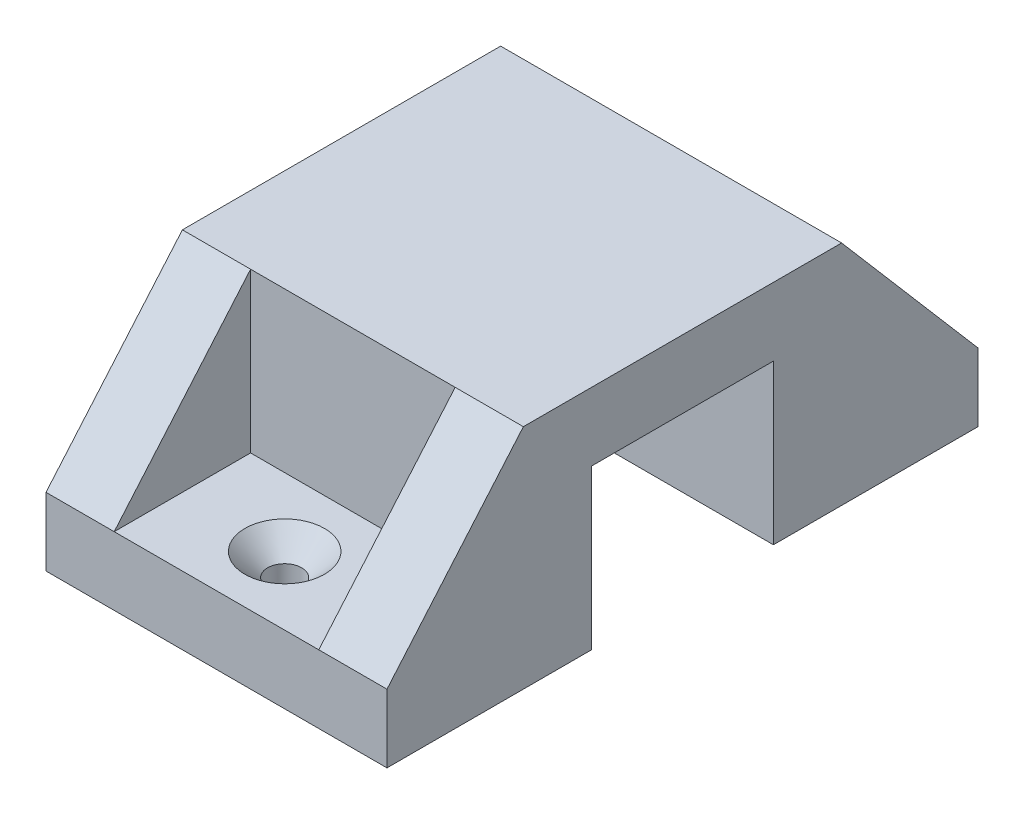
ISO-10303-21;
HEADER;
FILE_DESCRIPTION(('STEP AP214'),'2;1');
FILE_NAME('part.step','',(''),(''),'','','');
FILE_SCHEMA(('AUTOMOTIVE_DESIGN { 1 0 10303 214 1 1 1 1 }'));
ENDSEC;
DATA;
#1=APPLICATION_CONTEXT('core data for automotive mechanical design processes');
#2=APPLICATION_PROTOCOL_DEFINITION('international standard','automotive_design',2000,#1);
#3=PRODUCT_CONTEXT('',#1,'mechanical');
#4=PRODUCT('Part','Part','',(#3));
#5=PRODUCT_RELATED_PRODUCT_CATEGORY('part','',(#4));
#6=PRODUCT_DEFINITION_FORMATION('','',#4);
#7=PRODUCT_DEFINITION_CONTEXT('part definition',#1,'design');
#8=PRODUCT_DEFINITION('design','',#6,#7);
#9=PRODUCT_DEFINITION_SHAPE('','',#8);
#10=(LENGTH_UNIT() NAMED_UNIT(*) SI_UNIT(.MILLI.,.METRE.));
#11=(NAMED_UNIT(*) PLANE_ANGLE_UNIT() SI_UNIT($,.RADIAN.));
#12=(NAMED_UNIT(*) SI_UNIT($,.STERADIAN.) SOLID_ANGLE_UNIT());
#13=UNCERTAINTY_MEASURE_WITH_UNIT(LENGTH_MEASURE(1.E-05),#10,'distance_accuracy_value','');
#14=(GEOMETRIC_REPRESENTATION_CONTEXT(3) GLOBAL_UNCERTAINTY_ASSIGNED_CONTEXT((#13)) GLOBAL_UNIT_ASSIGNED_CONTEXT((#10,
#11,#12)) REPRESENTATION_CONTEXT('',''));
#15=CARTESIAN_POINT('',(0.,0.,0.));
#16=DIRECTION('',(0.,0.,1.));
#17=DIRECTION('',(1.,0.,0.));
#18=AXIS2_PLACEMENT_3D('',#15,#16,#17);
#19=CARTESIAN_POINT('',(-15.,20.,-14.));
#20=DIRECTION('',(0.,0.,1.));
#21=DIRECTION('',(1.,0.,0.));
#22=AXIS2_PLACEMENT_3D('',#19,#20,#21);
#23=PLANE('',#22);
#24=DIRECTION('',(0.,-1.,0.));
#25=VECTOR('',#24,1.);
#26=CARTESIAN_POINT('',(-9.00000000000001,20.,-14.));
#27=LINE('',#26,#25);
#28=CARTESIAN_POINT('',(-9.00000000000001,20.,-14.));
#29=VERTEX_POINT('',#28);
#30=CARTESIAN_POINT('',(-9.00000000000001,6.,-14.));
#31=VERTEX_POINT('',#30);
#32=EDGE_CURVE('E58',#29,#31,#27,.T.);
#33=ORIENTED_EDGE('',*,*,#32,.F.);
#34=DIRECTION('',(-1.,0.,0.));
#35=VECTOR('',#34,1.);
#36=CARTESIAN_POINT('',(-15.,20.,-14.));
#37=LINE('',#36,#35);
#38=CARTESIAN_POINT('',(9.00000000000001,20.,-14.));
#39=VERTEX_POINT('',#38);
#40=EDGE_CURVE('E273',#39,#29,#37,.T.);
#41=ORIENTED_EDGE('',*,*,#40,.F.);
#42=DIRECTION('',(0.,1.,0.));
#43=VECTOR('',#42,1.);
#44=CARTESIAN_POINT('',(9.00000000000001,20.,-14.));
#45=LINE('',#44,#43);
#46=CARTESIAN_POINT('',(9.00000000000001,6.,-14.));
#47=VERTEX_POINT('',#46);
#48=EDGE_CURVE('E198',#47,#39,#45,.T.);
#49=ORIENTED_EDGE('',*,*,#48,.F.);
#50=DIRECTION('',(-1.,0.,0.));
#51=VECTOR('',#50,1.);
#52=CARTESIAN_POINT('',(-15.,6.,-14.));
#53=LINE('',#52,#51);
#54=EDGE_CURVE('E160',#47,#31,#53,.T.);
#55=ORIENTED_EDGE('',*,*,#54,.T.);
#56=EDGE_LOOP('',(#33,#41,#49,#55));
#57=FACE_BOUND('',#56,.T.);
#58=ADVANCED_FACE('F35',(#57),#23,.F.);
#59=CARTESIAN_POINT('',(-15.,6.,-26.));
#60=DIRECTION('',(0.,1.,0.));
#61=DIRECTION('',(0.,0.,1.));
#62=AXIS2_PLACEMENT_3D('',#59,#60,#61);
#63=PLANE('',#62);
#64=CARTESIAN_POINT('',(0.,6.,-20.));
#65=DIRECTION('',(0.,1.,0.));
#66=DIRECTION('',(0.,0.,1.));
#67=AXIS2_PLACEMENT_3D('',#64,#65,#66);
#68=CIRCLE('',#67,3.5);
#69=CARTESIAN_POINT('',(0.,6.,-16.5));
#70=VERTEX_POINT('',#69);
#71=EDGE_CURVE('E44',#70,#70,#68,.F.);
#72=ORIENTED_EDGE('',*,*,#71,.T.);
#73=EDGE_LOOP('',(#72));
#74=FACE_BOUND('',#73,.T.);
#75=DIRECTION('',(-1.,0.,0.));
#76=VECTOR('',#75,1.);
#77=CARTESIAN_POINT('',(-15.,6.,-26.));
#78=LINE('',#77,#76);
#79=CARTESIAN_POINT('',(9.00000000000001,6.,-26.));
#80=VERTEX_POINT('',#79);
#81=CARTESIAN_POINT('',(-9.00000000000001,6.,-26.));
#82=VERTEX_POINT('',#81);
#83=EDGE_CURVE('E170',#80,#82,#78,.T.);
#84=ORIENTED_EDGE('',*,*,#83,.T.);
#85=DIRECTION('',(0.,0.,1.));
#86=VECTOR('',#85,1.);
#87=CARTESIAN_POINT('',(-9.00000000000001,6.,-26.));
#88=LINE('',#87,#86);
#89=EDGE_CURVE('E51',#82,#31,#88,.T.);
#90=ORIENTED_EDGE('',*,*,#89,.T.);
#91=ORIENTED_EDGE('',*,*,#54,.F.);
#92=DIRECTION('',(0.,0.,-1.));
#93=VECTOR('',#92,1.);
#94=CARTESIAN_POINT('',(9.00000000000001,6.,-26.));
#95=LINE('',#94,#93);
#96=EDGE_CURVE('E193',#47,#80,#95,.T.);
#97=ORIENTED_EDGE('',*,*,#96,.T.);
#98=EDGE_LOOP('',(#84,#90,#91,#97));
#99=FACE_BOUND('',#98,.T.);
#100=ADVANCED_FACE('F296',(#74,#99),#63,.T.);
#101=CARTESIAN_POINT('',(-15.,20.,14.));
#102=DIRECTION('',(0.,0.,-1.));
#103=DIRECTION('',(-1.,0.,0.));
#104=AXIS2_PLACEMENT_3D('',#101,#102,#103);
#105=PLANE('',#104);
#106=DIRECTION('',(0.,1.,0.));
#107=VECTOR('',#106,1.);
#108=CARTESIAN_POINT('',(-9.00000000000001,20.,14.));
#109=LINE('',#108,#107);
#110=CARTESIAN_POINT('',(-9.00000000000001,6.,14.));
#111=VERTEX_POINT('',#110);
#112=CARTESIAN_POINT('',(-9.00000000000001,20.,14.));
#113=VERTEX_POINT('',#112);
#114=EDGE_CURVE('E214',#111,#113,#109,.T.);
#115=ORIENTED_EDGE('',*,*,#114,.F.);
#116=DIRECTION('',(-1.,0.,0.));
#117=VECTOR('',#116,1.);
#118=CARTESIAN_POINT('',(-15.,6.,14.));
#119=LINE('',#118,#117);
#120=CARTESIAN_POINT('',(9.00000000000001,6.,14.));
#121=VERTEX_POINT('',#120);
#122=EDGE_CURVE('E229',#121,#111,#119,.T.);
#123=ORIENTED_EDGE('',*,*,#122,.F.);
#124=DIRECTION('',(0.,-1.,0.));
#125=VECTOR('',#124,1.);
#126=CARTESIAN_POINT('',(9.00000000000001,20.,14.));
#127=LINE('',#126,#125);
#128=CARTESIAN_POINT('',(9.00000000000001,20.,14.));
#129=VERTEX_POINT('',#128);
#130=EDGE_CURVE('E224',#129,#121,#127,.T.);
#131=ORIENTED_EDGE('',*,*,#130,.F.);
#132=DIRECTION('',(1.,0.,0.));
#133=VECTOR('',#132,1.);
#134=CARTESIAN_POINT('',(-15.,20.,14.));
#135=LINE('',#134,#133);
#136=EDGE_CURVE('E279',#113,#129,#135,.T.);
#137=ORIENTED_EDGE('',*,*,#136,.F.);
#138=EDGE_LOOP('',(#115,#123,#131,#137));
#139=FACE_BOUND('',#138,.T.);
#140=ADVANCED_FACE('F314',(#139),#105,.F.);
#141=CARTESIAN_POINT('',(-15.,6.,26.));
#142=DIRECTION('',(0.,-1.,0.));
#143=DIRECTION('',(0.,0.,-1.));
#144=AXIS2_PLACEMENT_3D('',#141,#142,#143);
#145=PLANE('',#144);
#146=CARTESIAN_POINT('',(0.,6.,20.));
#147=DIRECTION('',(0.,-1.,0.));
#148=DIRECTION('',(0.,0.,-1.));
#149=AXIS2_PLACEMENT_3D('',#146,#147,#148);
#150=CIRCLE('',#149,3.50000000000002);
#151=CARTESIAN_POINT('',(0.,6.,16.5));
#152=VERTEX_POINT('',#151);
#153=EDGE_CURVE('E291',#152,#152,#150,.T.);
#154=ORIENTED_EDGE('',*,*,#153,.T.);
#155=EDGE_LOOP('',(#154));
#156=FACE_BOUND('',#155,.T.);
#157=DIRECTION('',(0.,0.,-1.));
#158=VECTOR('',#157,1.);
#159=CARTESIAN_POINT('',(-9.00000000000001,6.,26.));
#160=LINE('',#159,#158);
#161=CARTESIAN_POINT('',(-9.00000000000001,6.,26.));
#162=VERTEX_POINT('',#161);
#163=EDGE_CURVE('E210',#162,#111,#160,.T.);
#164=ORIENTED_EDGE('',*,*,#163,.F.);
#165=DIRECTION('',(-1.,0.,0.));
#166=VECTOR('',#165,1.);
#167=CARTESIAN_POINT('',(-15.,6.,26.));
#168=LINE('',#167,#166);
#169=CARTESIAN_POINT('',(9.00000000000001,6.,26.));
#170=VERTEX_POINT('',#169);
#171=EDGE_CURVE('E243',#170,#162,#168,.T.);
#172=ORIENTED_EDGE('',*,*,#171,.F.);
#173=DIRECTION('',(0.,0.,1.));
#174=VECTOR('',#173,1.);
#175=CARTESIAN_POINT('',(9.00000000000001,6.,26.));
#176=LINE('',#175,#174);
#177=EDGE_CURVE('E220',#121,#170,#176,.T.);
#178=ORIENTED_EDGE('',*,*,#177,.F.);
#179=ORIENTED_EDGE('',*,*,#122,.T.);
#180=EDGE_LOOP('',(#164,#172,#178,#179));
#181=FACE_BOUND('',#180,.T.);
#182=ADVANCED_FACE('F402',(#156,#181),#145,.F.);
#183=CARTESIAN_POINT('',(0.,0.,0.));
#184=DIRECTION('',(0.,-1.,0.));
#185=DIRECTION('',(0.,0.,-1.));
#186=AXIS2_PLACEMENT_3D('',#183,#184,#185);
#187=PLANE('',#186);
#188=CARTESIAN_POINT('',(0.,0.,20.));
#189=DIRECTION('',(0.,1.,0.));
#190=DIRECTION('',(0.,0.,1.));
#191=AXIS2_PLACEMENT_3D('',#188,#189,#190);
#192=CIRCLE('',#191,1.5);
#193=CARTESIAN_POINT('',(0.,0.,21.5));
#194=VERTEX_POINT('',#193);
#195=EDGE_CURVE('E181',#194,#194,#192,.T.);
#196=ORIENTED_EDGE('',*,*,#195,.T.);
#197=EDGE_LOOP('',(#196));
#198=FACE_BOUND('',#197,.T.);
#199=DIRECTION('',(1.,0.,0.));
#200=VECTOR('',#199,1.);
#201=CARTESIAN_POINT('',(-15.,0.,8.));
#202=LINE('',#201,#200);
#203=CARTESIAN_POINT('',(-15.,0.,8.));
#204=VERTEX_POINT('',#203);
#205=CARTESIAN_POINT('',(15.,0.,8.));
#206=VERTEX_POINT('',#205);
#207=EDGE_CURVE('E263',#204,#206,#202,.T.);
#208=ORIENTED_EDGE('',*,*,#207,.T.);
#209=DIRECTION('',(0.,0.,-1.));
#210=VECTOR('',#209,1.);
#211=CARTESIAN_POINT('',(15.,0.,14.));
#212=LINE('',#211,#210);
#213=CARTESIAN_POINT('',(15.,0.,26.));
#214=VERTEX_POINT('',#213);
#215=EDGE_CURVE('E284',#214,#206,#212,.T.);
#216=ORIENTED_EDGE('',*,*,#215,.F.);
#217=DIRECTION('',(1.,0.,0.));
#218=VECTOR('',#217,1.);
#219=CARTESIAN_POINT('',(-15.,0.,26.));
#220=LINE('',#219,#218);
#221=CARTESIAN_POINT('',(-15.,0.,26.));
#222=VERTEX_POINT('',#221);
#223=EDGE_CURVE('E233',#222,#214,#220,.T.);
#224=ORIENTED_EDGE('',*,*,#223,.F.);
#225=DIRECTION('',(0.,0.,1.));
#226=VECTOR('',#225,1.);
#227=CARTESIAN_POINT('',(-15.,0.,14.));
#228=LINE('',#227,#226);
#229=EDGE_CURVE('E287',#204,#222,#228,.T.);
#230=ORIENTED_EDGE('',*,*,#229,.F.);
#231=EDGE_LOOP('',(#208,#216,#224,#230));
#232=FACE_BOUND('',#231,.T.);
#233=ADVANCED_FACE('F321',(#198,#232),#187,.T.);
#234=CARTESIAN_POINT('',(15.,20.,14.));
#235=DIRECTION('',(-1.,0.,0.));
#236=DIRECTION('',(0.,0.,1.));
#237=AXIS2_PLACEMENT_3D('',#234,#235,#236);
#238=PLANE('',#237);
#239=ORIENTED_EDGE('',*,*,#215,.T.);
#240=DIRECTION('',(0.,-1.,0.));
#241=VECTOR('',#240,1.);
#242=CARTESIAN_POINT('',(15.,0.,8.));
#243=LINE('',#242,#241);
#244=CARTESIAN_POINT('',(15.,14.,8.));
#245=VERTEX_POINT('',#244);
#246=EDGE_CURVE('E250',#245,#206,#243,.T.);
#247=ORIENTED_EDGE('',*,*,#246,.F.);
#248=DIRECTION('',(0.,0.,1.));
#249=VECTOR('',#248,1.);
#250=CARTESIAN_POINT('',(15.,14.,8.));
#251=LINE('',#250,#249);
#252=CARTESIAN_POINT('',(15.,14.,-8.));
#253=VERTEX_POINT('',#252);
#254=EDGE_CURVE('E258',#253,#245,#251,.T.);
#255=ORIENTED_EDGE('',*,*,#254,.F.);
#256=DIRECTION('',(0.,1.,0.));
#257=VECTOR('',#256,1.);
#258=CARTESIAN_POINT('',(15.,14.,-8.));
#259=LINE('',#258,#257);
#260=CARTESIAN_POINT('',(15.,0.,-8.));
#261=VERTEX_POINT('',#260);
#262=EDGE_CURVE('E242',#261,#253,#259,.T.);
#263=ORIENTED_EDGE('',*,*,#262,.F.);
#264=CARTESIAN_POINT('',(15.,0.,-26.));
#265=VERTEX_POINT('',#264);
#266=EDGE_CURVE('E265',#261,#265,#212,.T.);
#267=ORIENTED_EDGE('',*,*,#266,.T.);
#268=DIRECTION('',(0.,1.,0.));
#269=VECTOR('',#268,1.);
#270=CARTESIAN_POINT('',(15.,0.,-26.));
#271=LINE('',#270,#269);
#272=CARTESIAN_POINT('',(15.,6.,-26.));
#273=VERTEX_POINT('',#272);
#274=EDGE_CURVE('E202',#265,#273,#271,.T.);
#275=ORIENTED_EDGE('',*,*,#274,.T.);
#276=DIRECTION('',(0.,-0.759256602365297,-0.650791373455969));
#277=VECTOR('',#276,1.);
#278=CARTESIAN_POINT('',(15.,20.,-14.));
#279=LINE('',#278,#277);
#280=CARTESIAN_POINT('',(15.,20.,-14.));
#281=VERTEX_POINT('',#280);
#282=EDGE_CURVE('E190',#281,#273,#279,.T.);
#283=ORIENTED_EDGE('',*,*,#282,.F.);
#284=DIRECTION('',(0.,0.,-1.));
#285=VECTOR('',#284,1.);
#286=CARTESIAN_POINT('',(15.,20.,14.));
#287=LINE('',#286,#285);
#288=CARTESIAN_POINT('',(15.,20.,14.));
#289=VERTEX_POINT('',#288);
#290=EDGE_CURVE('E271',#289,#281,#287,.T.);
#291=ORIENTED_EDGE('',*,*,#290,.F.);
#292=DIRECTION('',(0.,-0.759256602365297,0.650791373455969));
#293=VECTOR('',#292,1.);
#294=CARTESIAN_POINT('',(15.,20.,14.));
#295=LINE('',#294,#293);
#296=CARTESIAN_POINT('',(15.,6.,26.));
#297=VERTEX_POINT('',#296);
#298=EDGE_CURVE('E217',#289,#297,#295,.T.);
#299=ORIENTED_EDGE('',*,*,#298,.T.);
#300=DIRECTION('',(0.,1.,0.));
#301=VECTOR('',#300,1.);
#302=CARTESIAN_POINT('',(15.,0.,26.));
#303=LINE('',#302,#301);
#304=EDGE_CURVE('E235',#214,#297,#303,.T.);
#305=ORIENTED_EDGE('',*,*,#304,.F.);
#306=EDGE_LOOP('',(#239,#247,#255,#263,#267,#275,#283,#291,#299,#305));
#307=FACE_BOUND('',#306,.T.);
#308=ADVANCED_FACE('F319',(#307),#238,.F.);
#309=CARTESIAN_POINT('',(-15.,20.,14.));
#310=DIRECTION('',(1.,0.,0.));
#311=DIRECTION('',(0.,0.,-1.));
#312=AXIS2_PLACEMENT_3D('',#309,#310,#311);
#313=PLANE('',#312);
#314=DIRECTION('',(0.,0.,1.));
#315=VECTOR('',#314,1.);
#316=CARTESIAN_POINT('',(-15.,14.,8.));
#317=LINE('',#316,#315);
#318=CARTESIAN_POINT('',(-15.,14.,-8.));
#319=VERTEX_POINT('',#318);
#320=CARTESIAN_POINT('',(-15.,14.,8.));
#321=VERTEX_POINT('',#320);
#322=EDGE_CURVE('E249',#319,#321,#317,.T.);
#323=ORIENTED_EDGE('',*,*,#322,.T.);
#324=DIRECTION('',(0.,-1.,0.));
#325=VECTOR('',#324,1.);
#326=CARTESIAN_POINT('',(-15.,0.,8.));
#327=LINE('',#326,#325);
#328=EDGE_CURVE('E252',#321,#204,#327,.T.);
#329=ORIENTED_EDGE('',*,*,#328,.T.);
#330=ORIENTED_EDGE('',*,*,#229,.T.);
#331=DIRECTION('',(0.,-1.,0.));
#332=VECTOR('',#331,1.);
#333=CARTESIAN_POINT('',(-15.,0.,26.));
#334=LINE('',#333,#332);
#335=CARTESIAN_POINT('',(-15.,6.,26.));
#336=VERTEX_POINT('',#335);
#337=EDGE_CURVE('E230',#336,#222,#334,.T.);
#338=ORIENTED_EDGE('',*,*,#337,.F.);
#339=DIRECTION('',(0.,-0.759256602365297,0.650791373455969));
#340=VECTOR('',#339,1.);
#341=CARTESIAN_POINT('',(-15.,20.,14.));
#342=LINE('',#341,#340);
#343=CARTESIAN_POINT('',(-15.,20.,14.));
#344=VERTEX_POINT('',#343);
#345=EDGE_CURVE('E208',#344,#336,#342,.T.);
#346=ORIENTED_EDGE('',*,*,#345,.F.);
#347=DIRECTION('',(0.,0.,1.));
#348=VECTOR('',#347,1.);
#349=CARTESIAN_POINT('',(-15.,20.,14.));
#350=LINE('',#349,#348);
#351=CARTESIAN_POINT('',(-15.,20.,-14.));
#352=VERTEX_POINT('',#351);
#353=EDGE_CURVE('E178',#352,#344,#350,.T.);
#354=ORIENTED_EDGE('',*,*,#353,.F.);
#355=DIRECTION('',(0.,-0.759256602365297,-0.650791373455969));
#356=VECTOR('',#355,1.);
#357=CARTESIAN_POINT('',(-15.,20.,-14.));
#358=LINE('',#357,#356);
#359=CARTESIAN_POINT('',(-15.,6.,-26.));
#360=VERTEX_POINT('',#359);
#361=EDGE_CURVE('E167',#352,#360,#358,.T.);
#362=ORIENTED_EDGE('',*,*,#361,.T.);
#363=DIRECTION('',(0.,-1.,0.));
#364=VECTOR('',#363,1.);
#365=CARTESIAN_POINT('',(-15.,0.,-26.));
#366=LINE('',#365,#364);
#367=CARTESIAN_POINT('',(-15.,0.,-26.));
#368=VERTEX_POINT('',#367);
#369=EDGE_CURVE('E151',#360,#368,#366,.T.);
#370=ORIENTED_EDGE('',*,*,#369,.T.);
#371=CARTESIAN_POINT('',(-15.,0.,-8.));
#372=VERTEX_POINT('',#371);
#373=EDGE_CURVE('E274',#368,#372,#228,.T.);
#374=ORIENTED_EDGE('',*,*,#373,.T.);
#375=DIRECTION('',(0.,1.,0.));
#376=VECTOR('',#375,1.);
#377=CARTESIAN_POINT('',(-15.,14.,-8.));
#378=LINE('',#377,#376);
#379=EDGE_CURVE('E246',#372,#319,#378,.T.);
#380=ORIENTED_EDGE('',*,*,#379,.T.);
#381=EDGE_LOOP('',(#323,#329,#330,#338,#346,#354,#362,#370,#374,#380));
#382=FACE_BOUND('',#381,.T.);
#383=ADVANCED_FACE('F175',(#382),#313,.F.);
#384=CARTESIAN_POINT('',(0.,20.,0.));
#385=DIRECTION('',(0.,-1.,0.));
#386=DIRECTION('',(0.,0.,-1.));
#387=AXIS2_PLACEMENT_3D('',#384,#385,#386);
#388=PLANE('',#387);
#389=EDGE_CURVE('E280',#344,#113,#135,.T.);
#390=ORIENTED_EDGE('',*,*,#389,.T.);
#391=ORIENTED_EDGE('',*,*,#136,.T.);
#392=DIRECTION('',(-1.,0.,0.));
#393=VECTOR('',#392,1.);
#394=CARTESIAN_POINT('',(0.,20.,14.));
#395=LINE('',#394,#393);
#396=EDGE_CURVE('E226',#289,#129,#395,.T.);
#397=ORIENTED_EDGE('',*,*,#396,.F.);
#398=ORIENTED_EDGE('',*,*,#290,.T.);
#399=EDGE_CURVE('E275',#281,#39,#37,.T.);
#400=ORIENTED_EDGE('',*,*,#399,.T.);
#401=ORIENTED_EDGE('',*,*,#40,.T.);
#402=DIRECTION('',(1.,0.,0.));
#403=VECTOR('',#402,1.);
#404=CARTESIAN_POINT('',(0.,20.,-14.));
#405=LINE('',#404,#403);
#406=EDGE_CURVE('E187',#352,#29,#405,.T.);
#407=ORIENTED_EDGE('',*,*,#406,.F.);
#408=ORIENTED_EDGE('',*,*,#353,.T.);
#409=EDGE_LOOP('',(#390,#391,#397,#398,#400,#401,#407,#408));
#410=FACE_BOUND('',#409,.T.);
#411=ADVANCED_FACE('F351',(#410),#388,.F.);
#412=CARTESIAN_POINT('',(0.,0.,-20.));
#413=DIRECTION('',(0.,-1.,0.));
#414=DIRECTION('',(0.,0.,-1.));
#415=AXIS2_PLACEMENT_3D('',#412,#413,#414);
#416=CIRCLE('',#415,1.5);
#417=CARTESIAN_POINT('',(0.,0.,-21.5));
#418=VERTEX_POINT('',#417);
#419=EDGE_CURVE('E342',#418,#418,#416,.T.);
#420=ORIENTED_EDGE('',*,*,#419,.F.);
#421=EDGE_LOOP('',(#420));
#422=FACE_BOUND('',#421,.T.);
#423=DIRECTION('',(1.,0.,0.));
#424=VECTOR('',#423,1.);
#425=CARTESIAN_POINT('',(-15.,0.,-26.));
#426=LINE('',#425,#424);
#427=EDGE_CURVE('E156',#368,#265,#426,.T.);
#428=ORIENTED_EDGE('',*,*,#427,.T.);
#429=ORIENTED_EDGE('',*,*,#266,.F.);
#430=DIRECTION('',(1.,0.,0.));
#431=VECTOR('',#430,1.);
#432=CARTESIAN_POINT('',(-15.,0.,-8.));
#433=LINE('',#432,#431);
#434=EDGE_CURVE('E255',#372,#261,#433,.T.);
#435=ORIENTED_EDGE('',*,*,#434,.F.);
#436=ORIENTED_EDGE('',*,*,#373,.F.);
#437=EDGE_LOOP('',(#428,#429,#435,#436));
#438=FACE_BOUND('',#437,.T.);
#439=ADVANCED_FACE('F347',(#422,#438),#187,.T.);
#440=CARTESIAN_POINT('',(-15.,0.,8.));
#441=DIRECTION('',(0.,0.,1.));
#442=DIRECTION('',(1.,0.,0.));
#443=AXIS2_PLACEMENT_3D('',#440,#441,#442);
#444=PLANE('',#443);
#445=DIRECTION('',(1.,0.,0.));
#446=VECTOR('',#445,1.);
#447=CARTESIAN_POINT('',(-15.,14.,8.));
#448=LINE('',#447,#446);
#449=EDGE_CURVE('E266',#321,#245,#448,.T.);
#450=ORIENTED_EDGE('',*,*,#449,.T.);
#451=ORIENTED_EDGE('',*,*,#246,.T.);
#452=ORIENTED_EDGE('',*,*,#207,.F.);
#453=ORIENTED_EDGE('',*,*,#328,.F.);
#454=EDGE_LOOP('',(#450,#451,#452,#453));
#455=FACE_BOUND('',#454,.T.);
#456=ADVANCED_FACE('F350',(#455),#444,.F.);
#457=CARTESIAN_POINT('',(-15.,14.,8.));
#458=DIRECTION('',(0.,1.,0.));
#459=DIRECTION('',(0.,0.,1.));
#460=AXIS2_PLACEMENT_3D('',#457,#458,#459);
#461=PLANE('',#460);
#462=DIRECTION('',(1.,0.,0.));
#463=VECTOR('',#462,1.);
#464=CARTESIAN_POINT('',(-15.,14.,-8.));
#465=LINE('',#464,#463);
#466=EDGE_CURVE('E268',#319,#253,#465,.T.);
#467=ORIENTED_EDGE('',*,*,#466,.T.);
#468=ORIENTED_EDGE('',*,*,#254,.T.);
#469=ORIENTED_EDGE('',*,*,#449,.F.);
#470=ORIENTED_EDGE('',*,*,#322,.F.);
#471=EDGE_LOOP('',(#467,#468,#469,#470));
#472=FACE_BOUND('',#471,.T.);
#473=ADVANCED_FACE('F408',(#472),#461,.F.);
#474=CARTESIAN_POINT('',(-15.,14.,-8.));
#475=DIRECTION('',(0.,0.,-1.));
#476=DIRECTION('',(0.,1.,0.));
#477=AXIS2_PLACEMENT_3D('',#474,#475,#476);
#478=PLANE('',#477);
#479=ORIENTED_EDGE('',*,*,#434,.T.);
#480=ORIENTED_EDGE('',*,*,#262,.T.);
#481=ORIENTED_EDGE('',*,*,#466,.F.);
#482=ORIENTED_EDGE('',*,*,#379,.F.);
#483=EDGE_LOOP('',(#479,#480,#481,#482));
#484=FACE_BOUND('',#483,.T.);
#485=ADVANCED_FACE('F400',(#484),#478,.F.);
#486=CARTESIAN_POINT('',(0.,0.,26.));
#487=DIRECTION('',(0.,0.,-1.));
#488=DIRECTION('',(-1.,0.,0.));
#489=AXIS2_PLACEMENT_3D('',#486,#487,#488);
#490=PLANE('',#489);
#491=ORIENTED_EDGE('',*,*,#223,.T.);
#492=ORIENTED_EDGE('',*,*,#304,.T.);
#493=EDGE_CURVE('E239',#297,#170,#168,.T.);
#494=ORIENTED_EDGE('',*,*,#493,.T.);
#495=ORIENTED_EDGE('',*,*,#171,.T.);
#496=EDGE_CURVE('E238',#162,#336,#168,.T.);
#497=ORIENTED_EDGE('',*,*,#496,.T.);
#498=ORIENTED_EDGE('',*,*,#337,.T.);
#499=EDGE_LOOP('',(#491,#492,#494,#495,#497,#498));
#500=FACE_BOUND('',#499,.T.);
#501=ADVANCED_FACE('F393',(#500),#490,.F.);
#502=CARTESIAN_POINT('',(9.00000000000001,10.,6.));
#503=DIRECTION('',(1.,0.,0.));
#504=DIRECTION('',(0.,0.,-1.));
#505=AXIS2_PLACEMENT_3D('',#502,#503,#504);
#506=PLANE('',#505);
#507=DIRECTION('',(0.,-0.759256602365297,0.650791373455969));
#508=VECTOR('',#507,1.);
#509=CARTESIAN_POINT('',(9.00000000000001,20.,14.));
#510=LINE('',#509,#508);
#511=EDGE_CURVE('E216',#129,#170,#510,.T.);
#512=ORIENTED_EDGE('',*,*,#511,.F.);
#513=ORIENTED_EDGE('',*,*,#130,.T.);
#514=ORIENTED_EDGE('',*,*,#177,.T.);
#515=EDGE_LOOP('',(#512,#513,#514));
#516=FACE_BOUND('',#515,.T.);
#517=ADVANCED_FACE('F390',(#516),#506,.F.);
#518=CARTESIAN_POINT('',(15.,20.,14.));
#519=DIRECTION('',(0.,0.650791373455969,0.759256602365297));
#520=DIRECTION('',(0.,-0.759256602365297,0.650791373455969));
#521=AXIS2_PLACEMENT_3D('',#518,#519,#520);
#522=PLANE('',#521);
#523=ORIENTED_EDGE('',*,*,#298,.F.);
#524=ORIENTED_EDGE('',*,*,#396,.T.);
#525=ORIENTED_EDGE('',*,*,#511,.T.);
#526=ORIENTED_EDGE('',*,*,#493,.F.);
#527=EDGE_LOOP('',(#523,#524,#525,#526));
#528=FACE_BOUND('',#527,.T.);
#529=ADVANCED_FACE('F385',(#528),#522,.T.);
#530=CARTESIAN_POINT('',(-9.00000000000001,10.,6.));
#531=DIRECTION('',(-1.,0.,0.));
#532=DIRECTION('',(0.,0.,1.));
#533=AXIS2_PLACEMENT_3D('',#530,#531,#532);
#534=PLANE('',#533);
#535=ORIENTED_EDGE('',*,*,#163,.T.);
#536=ORIENTED_EDGE('',*,*,#114,.T.);
#537=DIRECTION('',(0.,-0.759256602365297,0.650791373455969));
#538=VECTOR('',#537,1.);
#539=CARTESIAN_POINT('',(-9.00000000000001,20.,14.));
#540=LINE('',#539,#538);
#541=EDGE_CURVE('E206',#113,#162,#540,.T.);
#542=ORIENTED_EDGE('',*,*,#541,.T.);
#543=EDGE_LOOP('',(#535,#536,#542));
#544=FACE_BOUND('',#543,.T.);
#545=ADVANCED_FACE('F382',(#544),#534,.F.);
#546=CARTESIAN_POINT('',(-15.,20.,14.));
#547=DIRECTION('',(0.,-0.650791373455969,-0.759256602365297));
#548=DIRECTION('',(0.,-0.759256602365297,0.650791373455969));
#549=AXIS2_PLACEMENT_3D('',#546,#547,#548);
#550=PLANE('',#549);
#551=ORIENTED_EDGE('',*,*,#541,.F.);
#552=ORIENTED_EDGE('',*,*,#389,.F.);
#553=ORIENTED_EDGE('',*,*,#345,.T.);
#554=ORIENTED_EDGE('',*,*,#496,.F.);
#555=EDGE_LOOP('',(#551,#552,#553,#554));
#556=FACE_BOUND('',#555,.T.);
#557=ADVANCED_FACE('F380',(#556),#550,.F.);
#558=CARTESIAN_POINT('',(0.,0.,-26.));
#559=DIRECTION('',(0.,0.,1.));
#560=DIRECTION('',(-1.,0.,0.));
#561=AXIS2_PLACEMENT_3D('',#558,#559,#560);
#562=PLANE('',#561);
#563=EDGE_CURVE('E154',#82,#360,#78,.T.);
#564=ORIENTED_EDGE('',*,*,#563,.F.);
#565=ORIENTED_EDGE('',*,*,#83,.F.);
#566=EDGE_CURVE('E172',#273,#80,#78,.T.);
#567=ORIENTED_EDGE('',*,*,#566,.F.);
#568=ORIENTED_EDGE('',*,*,#274,.F.);
#569=ORIENTED_EDGE('',*,*,#427,.F.);
#570=ORIENTED_EDGE('',*,*,#369,.F.);
#571=EDGE_LOOP('',(#564,#565,#567,#568,#569,#570));
#572=FACE_BOUND('',#571,.T.);
#573=ADVANCED_FACE('F153',(#572),#562,.F.);
#574=CARTESIAN_POINT('',(9.00000000000001,10.,0.));
#575=DIRECTION('',(1.,0.,0.));
#576=DIRECTION('',(0.,0.,-1.));
#577=AXIS2_PLACEMENT_3D('',#574,#575,#576);
#578=PLANE('',#577);
#579=ORIENTED_EDGE('',*,*,#96,.F.);
#580=ORIENTED_EDGE('',*,*,#48,.T.);
#581=DIRECTION('',(0.,-0.759256602365297,-0.650791373455969));
#582=VECTOR('',#581,1.);
#583=CARTESIAN_POINT('',(9.00000000000001,20.,-14.));
#584=LINE('',#583,#582);
#585=EDGE_CURVE('E189',#39,#80,#584,.T.);
#586=ORIENTED_EDGE('',*,*,#585,.T.);
#587=EDGE_LOOP('',(#579,#580,#586));
#588=FACE_BOUND('',#587,.T.);
#589=ADVANCED_FACE('F365',(#588),#578,.F.);
#590=CARTESIAN_POINT('',(15.,20.,-14.));
#591=DIRECTION('',(0.,-0.650791373455969,0.759256602365297));
#592=DIRECTION('',(0.,-0.759256602365297,-0.650791373455969));
#593=AXIS2_PLACEMENT_3D('',#590,#591,#592);
#594=PLANE('',#593);
#595=ORIENTED_EDGE('',*,*,#585,.F.);
#596=ORIENTED_EDGE('',*,*,#399,.F.);
#597=ORIENTED_EDGE('',*,*,#282,.T.);
#598=ORIENTED_EDGE('',*,*,#566,.T.);
#599=EDGE_LOOP('',(#595,#596,#597,#598));
#600=FACE_BOUND('',#599,.T.);
#601=ADVANCED_FACE('F361',(#600),#594,.F.);
#602=CARTESIAN_POINT('',(-9.00000000000001,10.,0.));
#603=DIRECTION('',(-1.,0.,0.));
#604=DIRECTION('',(0.,0.,1.));
#605=AXIS2_PLACEMENT_3D('',#602,#603,#604);
#606=PLANE('',#605);
#607=DIRECTION('',(0.,-0.759256602365297,-0.650791373455969));
#608=VECTOR('',#607,1.);
#609=CARTESIAN_POINT('',(-9.00000000000001,20.,-14.));
#610=LINE('',#609,#608);
#611=EDGE_CURVE('E169',#29,#82,#610,.T.);
#612=ORIENTED_EDGE('',*,*,#611,.F.);
#613=ORIENTED_EDGE('',*,*,#32,.T.);
#614=ORIENTED_EDGE('',*,*,#89,.F.);
#615=EDGE_LOOP('',(#612,#613,#614));
#616=FACE_BOUND('',#615,.T.);
#617=ADVANCED_FACE('F367',(#616),#606,.F.);
#618=CARTESIAN_POINT('',(-15.,20.,-14.));
#619=DIRECTION('',(0.,0.650791373455969,-0.759256602365297));
#620=DIRECTION('',(0.,-0.759256602365297,-0.650791373455969));
#621=AXIS2_PLACEMENT_3D('',#618,#619,#620);
#622=PLANE('',#621);
#623=ORIENTED_EDGE('',*,*,#361,.F.);
#624=ORIENTED_EDGE('',*,*,#406,.T.);
#625=ORIENTED_EDGE('',*,*,#611,.T.);
#626=ORIENTED_EDGE('',*,*,#563,.T.);
#627=EDGE_LOOP('',(#623,#624,#625,#626));
#628=FACE_BOUND('',#627,.T.);
#629=ADVANCED_FACE('F165',(#628),#622,.T.);
#630=CARTESIAN_POINT('',(0.,0.,20.));
#631=DIRECTION('',(0.,1.,0.));
#632=DIRECTION('',(0.,0.,1.));
#633=AXIS2_PLACEMENT_3D('',#630,#631,#632);
#634=CYLINDRICAL_SURFACE('',#633,1.5);
#635=CARTESIAN_POINT('',(0.,3.99999999999999,20.));
#636=DIRECTION('',(0.,-1.,0.));
#637=DIRECTION('',(0.,0.,-1.));
#638=AXIS2_PLACEMENT_3D('',#635,#636,#637);
#639=CIRCLE('',#638,1.5);
#640=CARTESIAN_POINT('',(0.,3.99999999999999,18.5));
#641=VERTEX_POINT('',#640);
#642=EDGE_CURVE('E283',#641,#641,#639,.F.);
#643=ORIENTED_EDGE('',*,*,#642,.T.);
#644=EDGE_LOOP('',(#643));
#645=FACE_BOUND('',#644,.T.);
#646=ORIENTED_EDGE('',*,*,#195,.F.);
#647=EDGE_LOOP('',(#646));
#648=FACE_BOUND('',#647,.T.);
#649=ADVANCED_FACE('F327',(#645,#648),#634,.F.);
#650=CARTESIAN_POINT('',(0.,3.99999999999999,20.));
#651=DIRECTION('',(0.,1.,0.));
#652=DIRECTION('',(0.,0.,1.));
#653=AXIS2_PLACEMENT_3D('',#650,#651,#652);
#654=CONICAL_SURFACE('',#653,1.5,0.78539816339745);
#655=ORIENTED_EDGE('',*,*,#153,.F.);
#656=EDGE_LOOP('',(#655));
#657=FACE_BOUND('',#656,.T.);
#658=ORIENTED_EDGE('',*,*,#642,.F.);
#659=EDGE_LOOP('',(#658));
#660=FACE_BOUND('',#659,.T.);
#661=ADVANCED_FACE('F304',(#657,#660),#654,.F.);
#662=CARTESIAN_POINT('',(0.,0.,-20.));
#663=DIRECTION('',(0.,1.,0.));
#664=DIRECTION('',(0.,0.,1.));
#665=AXIS2_PLACEMENT_3D('',#662,#663,#664);
#666=CYLINDRICAL_SURFACE('',#665,1.5);
#667=CARTESIAN_POINT('',(0.,4.,-20.));
#668=DIRECTION('',(0.,1.,0.));
#669=DIRECTION('',(0.,0.,1.));
#670=AXIS2_PLACEMENT_3D('',#667,#668,#669);
#671=CIRCLE('',#670,1.5);
#672=CARTESIAN_POINT('',(0.,4.,-18.5));
#673=VERTEX_POINT('',#672);
#674=EDGE_CURVE('E11',#673,#673,#671,.T.);
#675=ORIENTED_EDGE('',*,*,#674,.T.);
#676=EDGE_LOOP('',(#675));
#677=FACE_BOUND('',#676,.T.);
#678=ORIENTED_EDGE('',*,*,#419,.T.);
#679=EDGE_LOOP('',(#678));
#680=FACE_BOUND('',#679,.T.);
#681=ADVANCED_FACE('F299',(#677,#680),#666,.F.);
#682=CARTESIAN_POINT('',(0.,6.,-20.));
#683=DIRECTION('',(0.,1.,0.));
#684=DIRECTION('',(0.,0.,1.));
#685=AXIS2_PLACEMENT_3D('',#682,#683,#684);
#686=CONICAL_SURFACE('',#685,3.5,0.785398163397448);
#687=ORIENTED_EDGE('',*,*,#674,.F.);
#688=EDGE_LOOP('',(#687));
#689=FACE_BOUND('',#688,.T.);
#690=ORIENTED_EDGE('',*,*,#71,.F.);
#691=EDGE_LOOP('',(#690));
#692=FACE_BOUND('',#691,.T.);
#693=ADVANCED_FACE('F38',(#689,#692),#686,.F.);
#694=CLOSED_SHELL('',(#58,#100,#140,#182,#233,#308,#383,#411,#439,#456,#473,#485,#501,#517,#529,
#545,#557,#573,#589,#601,#617,#629,#649,#661,#681,#693));
#695=MANIFOLD_SOLID_BREP('B2',#694);
#696=ADVANCED_BREP_SHAPE_REPRESENTATION('',(#18,#695),#14);
#697=SHAPE_DEFINITION_REPRESENTATION(#9,#696);
ENDSEC;
END-ISO-10303-21;
